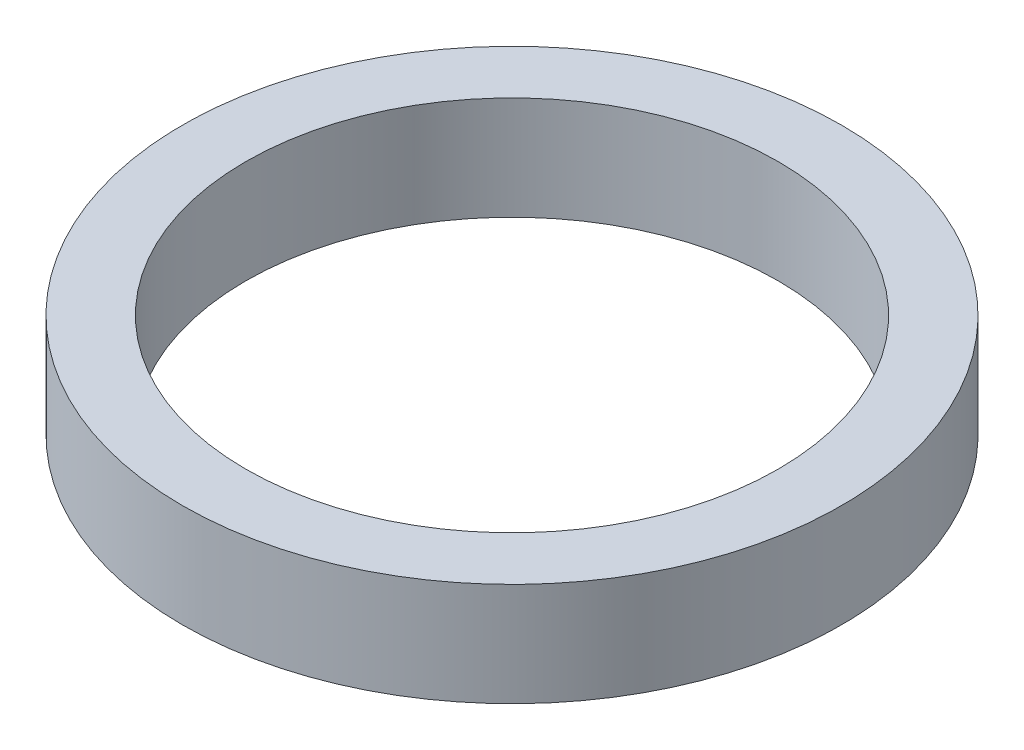
ISO-10303-21;
HEADER;
FILE_DESCRIPTION(('STEP AP214'),'2;1');
FILE_NAME('part.step','',(''),(''),'','','');
FILE_SCHEMA(('AUTOMOTIVE_DESIGN { 1 0 10303 214 1 1 1 1 }'));
ENDSEC;
DATA;
#1=APPLICATION_CONTEXT('core data for automotive mechanical design processes');
#2=APPLICATION_PROTOCOL_DEFINITION('international standard','automotive_design',2000,#1);
#3=PRODUCT_CONTEXT('',#1,'mechanical');
#4=PRODUCT('Part','Part','',(#3));
#5=PRODUCT_RELATED_PRODUCT_CATEGORY('part','',(#4));
#6=PRODUCT_DEFINITION_FORMATION('','',#4);
#7=PRODUCT_DEFINITION_CONTEXT('part definition',#1,'design');
#8=PRODUCT_DEFINITION('design','',#6,#7);
#9=PRODUCT_DEFINITION_SHAPE('','',#8);
#10=(LENGTH_UNIT() NAMED_UNIT(*) SI_UNIT(.MILLI.,.METRE.));
#11=(NAMED_UNIT(*) PLANE_ANGLE_UNIT() SI_UNIT($,.RADIAN.));
#12=(NAMED_UNIT(*) SI_UNIT($,.STERADIAN.) SOLID_ANGLE_UNIT());
#13=UNCERTAINTY_MEASURE_WITH_UNIT(LENGTH_MEASURE(1.E-05),#10,'distance_accuracy_value','');
#14=(GEOMETRIC_REPRESENTATION_CONTEXT(3) GLOBAL_UNCERTAINTY_ASSIGNED_CONTEXT((#13)) GLOBAL_UNIT_ASSIGNED_CONTEXT((#10,
#11,#12)) REPRESENTATION_CONTEXT('',''));
#15=CARTESIAN_POINT('',(0.,0.,0.));
#16=DIRECTION('',(0.,0.,1.));
#17=DIRECTION('',(1.,0.,0.));
#18=AXIS2_PLACEMENT_3D('',#15,#16,#17);
#19=CARTESIAN_POINT('',(0.,4.9,0.));
#20=DIRECTION('',(0.,1.,0.));
#21=DIRECTION('',(0.,0.,1.));
#22=AXIS2_PLACEMENT_3D('',#19,#20,#21);
#23=PLANE('',#22);
#24=CARTESIAN_POINT('',(0.,4.9,0.));
#25=DIRECTION('',(0.,1.,0.));
#26=DIRECTION('',(0.,0.,1.));
#27=AXIS2_PLACEMENT_3D('',#24,#25,#26);
#28=CIRCLE('',#27,15.63);
#29=CARTESIAN_POINT('',(0.,4.9,15.63));
#30=VERTEX_POINT('',#29);
#31=EDGE_CURVE('E10',#30,#30,#28,.T.);
#32=ORIENTED_EDGE('',*,*,#31,.T.);
#33=EDGE_LOOP('',(#32));
#34=FACE_BOUND('',#33,.T.);
#35=CARTESIAN_POINT('',(0.,4.9,0.));
#36=DIRECTION('',(0.,1.,0.));
#37=DIRECTION('',(0.,0.,1.));
#38=AXIS2_PLACEMENT_3D('',#35,#36,#37);
#39=CIRCLE('',#38,12.63);
#40=CARTESIAN_POINT('',(0.,4.9,12.63));
#41=VERTEX_POINT('',#40);
#42=EDGE_CURVE('E50',#41,#41,#39,.T.);
#43=ORIENTED_EDGE('',*,*,#42,.F.);
#44=EDGE_LOOP('',(#43));
#45=FACE_BOUND('',#44,.T.);
#46=ADVANCED_FACE('F37',(#34,#45),#23,.T.);
#47=CARTESIAN_POINT('',(0.,0.,0.));
#48=DIRECTION('',(0.,1.,0.));
#49=DIRECTION('',(0.,0.,1.));
#50=AXIS2_PLACEMENT_3D('',#47,#48,#49);
#51=PLANE('',#50);
#52=CARTESIAN_POINT('',(0.,0.,0.));
#53=DIRECTION('',(0.,1.,0.));
#54=DIRECTION('',(0.,0.,1.));
#55=AXIS2_PLACEMENT_3D('',#52,#53,#54);
#56=CIRCLE('',#55,15.63);
#57=CARTESIAN_POINT('',(0.,0.,15.63));
#58=VERTEX_POINT('',#57);
#59=EDGE_CURVE('E41',#58,#58,#56,.T.);
#60=ORIENTED_EDGE('',*,*,#59,.F.);
#61=EDGE_LOOP('',(#60));
#62=FACE_BOUND('',#61,.T.);
#63=CARTESIAN_POINT('',(0.,0.,0.));
#64=DIRECTION('',(0.,1.,0.));
#65=DIRECTION('',(0.,0.,1.));
#66=AXIS2_PLACEMENT_3D('',#63,#64,#65);
#67=CIRCLE('',#66,12.63);
#68=CARTESIAN_POINT('',(0.,0.,12.63));
#69=VERTEX_POINT('',#68);
#70=EDGE_CURVE('E52',#69,#69,#67,.T.);
#71=ORIENTED_EDGE('',*,*,#70,.T.);
#72=EDGE_LOOP('',(#71));
#73=FACE_BOUND('',#72,.T.);
#74=ADVANCED_FACE('F64',(#62,#73),#51,.F.);
#75=CARTESIAN_POINT('',(0.,4.9,0.));
#76=DIRECTION('',(0.,-1.,0.));
#77=DIRECTION('',(0.,0.,-1.));
#78=AXIS2_PLACEMENT_3D('',#75,#76,#77);
#79=CYLINDRICAL_SURFACE('',#78,15.63);
#80=ORIENTED_EDGE('',*,*,#31,.F.);
#81=EDGE_LOOP('',(#80));
#82=FACE_BOUND('',#81,.T.);
#83=ORIENTED_EDGE('',*,*,#59,.T.);
#84=EDGE_LOOP('',(#83));
#85=FACE_BOUND('',#84,.T.);
#86=ADVANCED_FACE('F39',(#82,#85),#79,.T.);
#87=CARTESIAN_POINT('',(0.,4.9,0.));
#88=DIRECTION('',(0.,-1.,0.));
#89=DIRECTION('',(0.,0.,-1.));
#90=AXIS2_PLACEMENT_3D('',#87,#88,#89);
#91=CYLINDRICAL_SURFACE('',#90,12.63);
#92=ORIENTED_EDGE('',*,*,#42,.T.);
#93=EDGE_LOOP('',(#92));
#94=FACE_BOUND('',#93,.T.);
#95=ORIENTED_EDGE('',*,*,#70,.F.);
#96=EDGE_LOOP('',(#95));
#97=FACE_BOUND('',#96,.T.);
#98=ADVANCED_FACE('F60',(#94,#97),#91,.F.);
#99=CLOSED_SHELL('',(#46,#74,#86,#98));
#100=MANIFOLD_SOLID_BREP('B2',#99);
#101=ADVANCED_BREP_SHAPE_REPRESENTATION('',(#18,#100),#14);
#102=SHAPE_DEFINITION_REPRESENTATION(#9,#101);
ENDSEC;
END-ISO-10303-21;
